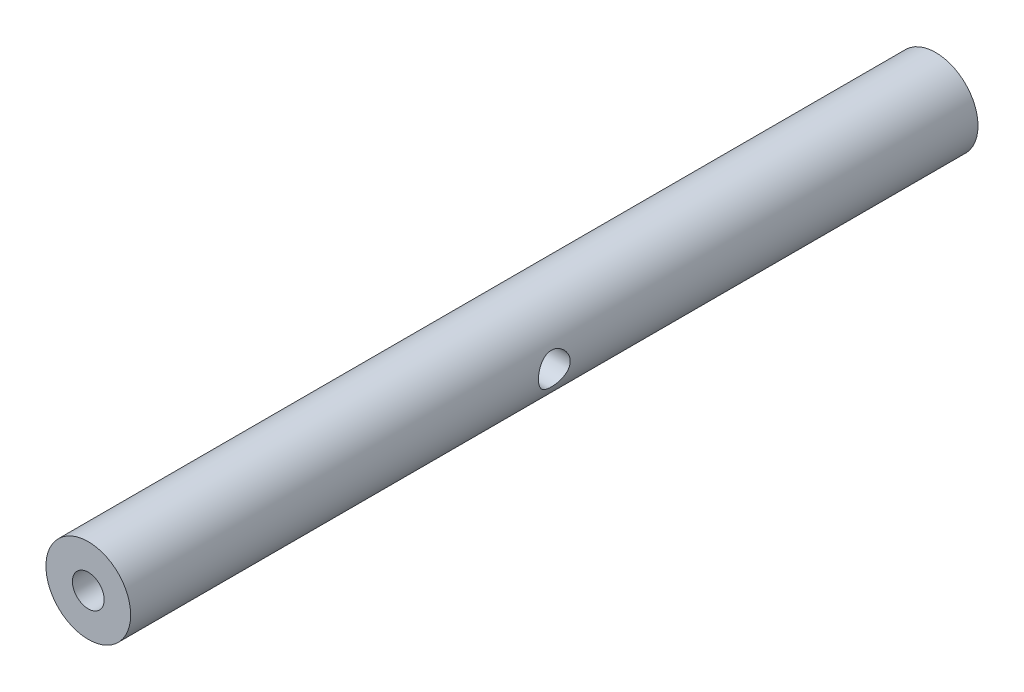
ISO-10303-21;
HEADER;
FILE_DESCRIPTION(('STEP AP214'),'2;1');
FILE_NAME('part.step','',(''),(''),'','','');
FILE_SCHEMA(('AUTOMOTIVE_DESIGN { 1 0 10303 214 1 1 1 1 }'));
ENDSEC;
DATA;
#1=APPLICATION_CONTEXT('core data for automotive mechanical design processes');
#2=APPLICATION_PROTOCOL_DEFINITION('international standard','automotive_design',2000,#1);
#3=PRODUCT_CONTEXT('',#1,'mechanical');
#4=PRODUCT('Part','Part','',(#3));
#5=PRODUCT_RELATED_PRODUCT_CATEGORY('part','',(#4));
#6=PRODUCT_DEFINITION_FORMATION('','',#4);
#7=PRODUCT_DEFINITION_CONTEXT('part definition',#1,'design');
#8=PRODUCT_DEFINITION('design','',#6,#7);
#9=PRODUCT_DEFINITION_SHAPE('','',#8);
#10=(LENGTH_UNIT() NAMED_UNIT(*) SI_UNIT(.MILLI.,.METRE.));
#11=(NAMED_UNIT(*) PLANE_ANGLE_UNIT() SI_UNIT($,.RADIAN.));
#12=(NAMED_UNIT(*) SI_UNIT($,.STERADIAN.) SOLID_ANGLE_UNIT());
#13=UNCERTAINTY_MEASURE_WITH_UNIT(LENGTH_MEASURE(1.E-05),#10,'distance_accuracy_value','');
#14=(GEOMETRIC_REPRESENTATION_CONTEXT(3) GLOBAL_UNCERTAINTY_ASSIGNED_CONTEXT((#13)) GLOBAL_UNIT_ASSIGNED_CONTEXT((#10,
#11,#12)) REPRESENTATION_CONTEXT('',''));
#15=CARTESIAN_POINT('',(0.,0.,0.));
#16=DIRECTION('',(0.,0.,1.));
#17=DIRECTION('',(1.,0.,0.));
#18=AXIS2_PLACEMENT_3D('',#15,#16,#17);
#19=CARTESIAN_POINT('',(0.,0.,80.));
#20=DIRECTION('',(0.,0.,-1.));
#21=DIRECTION('',(-1.,0.,0.));
#22=AXIS2_PLACEMENT_3D('',#19,#20,#21);
#23=CYLINDRICAL_SURFACE('',#22,1.5);
#24=CARTESIAN_POINT('',(0.,0.,40.));
#25=DIRECTION('',(0.707106781186547,0.,-0.707106781186547));
#26=DIRECTION('',(0.707106781186547,0.,0.707106781186547));
#27=AXIS2_PLACEMENT_3D('',#24,#25,#26);
#28=ELLIPSE('',#27,2.12132034355961,1.49999999999998);
#29=CARTESIAN_POINT('',(0.,1.5,40.));
#30=VERTEX_POINT('',#29);
#31=CARTESIAN_POINT('',(0.,-1.5,40.));
#32=VERTEX_POINT('',#31);
#33=EDGE_CURVE('E46',#30,#32,#28,.F.);
#34=ORIENTED_EDGE('',*,*,#33,.T.);
#35=CARTESIAN_POINT('',(0.,0.,40.));
#36=DIRECTION('',(-0.707106781186547,0.,-0.707106781186547));
#37=DIRECTION('',(-0.707106781186547,0.,0.707106781186547));
#38=AXIS2_PLACEMENT_3D('',#35,#36,#37);
#39=ELLIPSE('',#38,2.12132034355961,1.49999999999998);
#40=EDGE_CURVE('E59',#30,#32,#39,.T.);
#41=ORIENTED_EDGE('',*,*,#40,.F.);
#42=EDGE_LOOP('',(#34,#41));
#43=FACE_BOUND('',#42,.T.);
#44=CARTESIAN_POINT('',(0.,0.,0.));
#45=DIRECTION('',(0.,0.,1.));
#46=DIRECTION('',(1.,0.,0.));
#47=AXIS2_PLACEMENT_3D('',#44,#45,#46);
#48=CIRCLE('',#47,1.5);
#49=CARTESIAN_POINT('',(1.5,0.,0.));
#50=VERTEX_POINT('',#49);
#51=EDGE_CURVE('E86',#50,#50,#48,.T.);
#52=ORIENTED_EDGE('',*,*,#51,.F.);
#53=EDGE_LOOP('',(#52));
#54=FACE_BOUND('',#53,.T.);
#55=ADVANCED_FACE('F32',(#43,#54),#23,.F.);
#56=CARTESIAN_POINT('',(0.,0.,80.));
#57=DIRECTION('',(0.,0.,-1.));
#58=DIRECTION('',(-1.,0.,0.));
#59=AXIS2_PLACEMENT_3D('',#56,#57,#58);
#60=CYLINDRICAL_SURFACE('',#59,4.);
#61=CARTESIAN_POINT('',(-4.,0.,38.5));
#62=CARTESIAN_POINT('',(-4.00000217456151,-0.081235058937851,38.4999970976969));
#63=CARTESIAN_POINT('',(-3.99750379283184,-0.162450241781788,38.5066197602484));
#64=CARTESIAN_POINT('',(-3.98778696006927,-0.322453452352353,38.53282819527));
#65=CARTESIAN_POINT('',(-3.98056918893993,-0.401241827987605,38.5524121004706));
#66=CARTESIAN_POINT('',(-3.96218832391545,-0.554060784990863,38.6037530017718));
#67=CARTESIAN_POINT('',(-3.9510328434944,-0.62810022416226,38.6354865168218));
#68=CARTESIAN_POINT('',(-3.92588767765353,-0.769799310160232,38.7101064130159));
#69=CARTESIAN_POINT('',(-3.91189723227548,-0.837457239177856,38.7529957855442));
#70=CARTESIAN_POINT('',(-3.88186246971217,-0.967346417045797,38.850612531071));
#71=CARTESIAN_POINT('',(-3.86576002583566,-1.02927073015116,38.9057302622594));
#72=CARTESIAN_POINT('',(-3.83360220871327,-1.1432442147436,39.0254104346589));
#73=CARTESIAN_POINT('',(-3.81754685135033,-1.19529036359199,39.0899757560879));
#74=CARTESIAN_POINT('',(-3.78662470617732,-1.28998202215981,39.2297174675232));
#75=CARTESIAN_POINT('',(-3.77182648820819,-1.33219393195756,39.3052043665458));
#76=CARTESIAN_POINT('',(-3.74599860237434,-1.4031864633408,39.4628483541685));
#77=CARTESIAN_POINT('',(-3.73496742975882,-1.43197244961235,39.5450027631551));
#78=CARTESIAN_POINT('',(-3.71854412824137,-1.47408431017545,39.7101167402582));
#79=CARTESIAN_POINT('',(-3.71293924350839,-1.48799593218553,39.7929050384355));
#80=CARTESIAN_POINT('',(-3.70738061461216,-1.50179556531643,39.9598161579938));
#81=CARTESIAN_POINT('',(-3.70742453659306,-1.50168936802626,40.0439384138745));
#82=CARTESIAN_POINT('',(-3.71297511632056,-1.48790429610013,40.205769525213));
#83=CARTESIAN_POINT('',(-3.71815468871123,-1.47503808508999,40.2835609060442));
#84=CARTESIAN_POINT('',(-3.73284938059531,-1.43744167868325,40.4357871504053));
#85=CARTESIAN_POINT('',(-3.74236515298864,-1.41270969663254,40.5102215066139));
#86=CARTESIAN_POINT('',(-3.76485702190254,-1.35163748571899,40.6552770677282));
#87=CARTESIAN_POINT('',(-3.77789517988167,-1.31508648737096,40.7257994861213));
#88=CARTESIAN_POINT('',(-3.8059421013932,-1.23156073762694,40.8599457375909));
#89=CARTESIAN_POINT('',(-3.82095154457158,-1.18458238728893,40.9235671775197));
#90=CARTESIAN_POINT('',(-3.85248038859114,-1.07781780766545,41.0466036636508));
#91=CARTESIAN_POINT('',(-3.86903347455671,-1.01738298716952,41.1054486407481));
#92=CARTESIAN_POINT('',(-3.90091728164086,-0.88731259081899,41.2123379662058));
#93=CARTESIAN_POINT('',(-3.91624781465952,-0.817675603497334,41.2603806546056));
#94=CARTESIAN_POINT('',(-3.9442639480908,-0.669723436992392,41.3449303970625));
#95=CARTESIAN_POINT('',(-3.95690498259616,-0.591290713844694,41.381247581221));
#96=CARTESIAN_POINT('',(-3.97778718326962,-0.428836850524563,41.43998260427));
#97=CARTESIAN_POINT('',(-3.98603030341493,-0.344818210845749,41.4624066165611));
#98=CARTESIAN_POINT('',(-3.99684443228065,-0.178375243148652,41.4916227875419));
#99=CARTESIAN_POINT('',(-3.99969369025686,-0.0961036195621986,41.4991826063825));
#100=CARTESIAN_POINT('',(-4.00025893700125,0.06857247525503,41.5006910638999));
#101=CARTESIAN_POINT('',(-3.99797606386863,0.150976912983376,41.4946427203167));
#102=CARTESIAN_POINT('',(-3.98871709772643,0.310262048561857,41.4696899576913));
#103=CARTESIAN_POINT('',(-3.98192470962304,0.387233328007331,41.4512884562629));
#104=CARTESIAN_POINT('',(-3.96451477091717,0.536941754957212,41.4028139274526));
#105=CARTESIAN_POINT('',(-3.9538967228203,0.609678350347524,41.3727393820519));
#106=CARTESIAN_POINT('',(-3.92949624407681,0.75124776511014,41.3008135875605));
#107=CARTESIAN_POINT('',(-3.91563000209348,0.819903083557777,41.2586422707766));
#108=CARTESIAN_POINT('',(-3.88626671564664,0.949392711726602,41.1640818968284));
#109=CARTESIAN_POINT('',(-3.87076907009516,1.01022412027043,41.1116890674548));
#110=CARTESIAN_POINT('',(-3.8387332949099,1.12603079874451,40.9945958778757));
#111=CARTESIAN_POINT('',(-3.8221869650373,1.18046154123565,40.9293578172273));
#112=CARTESIAN_POINT('',(-3.79078815746854,1.277710500319,40.7903486152923));
#113=CARTESIAN_POINT('',(-3.775935831944,1.32052767414515,40.7165767086115));
#114=CARTESIAN_POINT('',(-3.74966829822464,1.39337773518994,40.5619840132277));
#115=CARTESIAN_POINT('',(-3.73826760328495,1.42335685446914,40.4811352540895));
#116=CARTESIAN_POINT('',(-3.72054032891006,1.46907883466885,40.3149902363122));
#117=CARTESIAN_POINT('',(-3.71421061057492,1.48483050305531,40.2296967638019));
#118=CARTESIAN_POINT('',(-3.70775894792575,1.50086347097834,40.0629838404589));
#119=CARTESIAN_POINT('',(-3.70726444523343,1.50207331495833,39.9816673682831));
#120=CARTESIAN_POINT('',(-3.71158412745294,1.49136715641588,39.8200546837238));
#121=CARTESIAN_POINT('',(-3.716397808989,1.47945239850119,39.7397583753284));
#122=CARTESIAN_POINT('',(-3.73048141585434,1.44355815630237,39.5849527732834));
#123=CARTESIAN_POINT('',(-3.73961085376664,1.41995798316519,39.5103416537547));
#124=CARTESIAN_POINT('',(-3.76121548297846,1.36169696779914,39.3660944915056));
#125=CARTESIAN_POINT('',(-3.77369151995216,1.32703332944939,39.2964597119299));
#126=CARTESIAN_POINT('',(-3.80139723903966,1.24552075938149,39.1601732103024));
#127=CARTESIAN_POINT('',(-3.81673698440965,1.19812832803005,39.0938692032001));
#128=CARTESIAN_POINT('',(-3.84806246757178,1.09334485729901,38.9698584390288));
#129=CARTESIAN_POINT('',(-3.86404840943146,1.03595064012804,38.9121544252133));
#130=CARTESIAN_POINT('',(-3.89590424609882,0.909080396784581,38.8037980441782));
#131=CARTESIAN_POINT('',(-3.91172104900645,0.839118644212953,38.7536962465654));
#132=CARTESIAN_POINT('',(-3.94054514457031,0.691213223200787,38.6659773447235));
#133=CARTESIAN_POINT('',(-3.95355221851559,0.61326893409059,38.6283612122637));
#134=CARTESIAN_POINT('',(-3.9757429260668,0.447999082002287,38.5656231709517));
#135=CARTESIAN_POINT('',(-3.98473657158356,0.360413422234188,38.5411129353981));
#136=CARTESIAN_POINT('',(-3.99686242179586,0.181875733606372,38.5083070400794));
#137=CARTESIAN_POINT('',(-3.99999756603967,0.0909254163648539,38.5000032485127));
#138=CARTESIAN_POINT('',(-4.,0.,38.5));
#139=B_SPLINE_CURVE_WITH_KNOTS('',3,(#61,#62,#63,#64,#65,#66,#67,#68,#69,#70,#71,#72,#73,#74,
#75,#76,#77,#78,#79,#80,#81,#82,#83,#84,#85,#86,#87,#88,#89,#90,#91,#92,#93,#94,#95,#96,#97,#98,
#99,#100,#101,#102,#103,#104,#105,#106,#107,#108,#109,#110,#111,#112,#113,#114,#115,#116,#117,
#118,#119,#120,#121,#122,#123,#124,#125,#126,#127,#128,#129,#130,#131,#132,#133,#134,#135,#136,
#137,#138),.UNSPECIFIED.,.T.,.F.,(4,2,2,2,2,2,2,2,2,2,2,2,2,2,2,2,2,2,2,2,2,2,2,2,2,2,2,2,2,2,2,
2,2,2,2,2,2,2,4),(0.,0.243369801560554,0.486704549530447,0.729571369213553,0.972503379609465,
1.22473618582712,1.47704604925617,1.73896674501654,2.00078269352128,2.25185874416895,
2.502831060797,2.73878345119963,2.9747713806058,3.21522408387008,3.45575990744248,
3.71246153335801,3.96920257905054,4.22991375286062,4.49050899698832,4.73725019635911,
4.98393668390505,5.22114437923824,5.45838293254437,5.70259221859582,5.94689180019849,
6.20536519455639,6.46386178920121,6.72343066727183,6.98283874956486,7.2255876348023,
7.46831350211236,7.70363142426512,7.93900886656483,8.18672471884247,8.43451941997036,
8.69572329654012,8.95694749805075,9.22948515032013,9.50188601796097),.UNSPECIFIED.);
#140=CARTESIAN_POINT('',(-4.,0.,38.5));
#141=VERTEX_POINT('',#140);
#142=EDGE_CURVE('E60',#141,#141,#139,.T.);
#143=ORIENTED_EDGE('',*,*,#142,.F.);
#144=EDGE_LOOP('',(#143));
#145=FACE_BOUND('',#144,.T.);
#146=CARTESIAN_POINT('',(0.,0.,80.));
#147=DIRECTION('',(0.,0.,1.));
#148=DIRECTION('',(1.,0.,0.));
#149=AXIS2_PLACEMENT_3D('',#146,#147,#148);
#150=CIRCLE('',#149,4.);
#151=CARTESIAN_POINT('',(4.,0.,80.));
#152=VERTEX_POINT('',#151);
#153=EDGE_CURVE('E11',#152,#152,#150,.T.);
#154=ORIENTED_EDGE('',*,*,#153,.F.);
#155=EDGE_LOOP('',(#154));
#156=FACE_BOUND('',#155,.T.);
#157=CARTESIAN_POINT('',(0.,0.,0.));
#158=DIRECTION('',(0.,0.,1.));
#159=DIRECTION('',(1.,0.,0.));
#160=AXIS2_PLACEMENT_3D('',#157,#158,#159);
#161=CIRCLE('',#160,4.);
#162=CARTESIAN_POINT('',(4.,0.,0.));
#163=VERTEX_POINT('',#162);
#164=EDGE_CURVE('E36',#163,#163,#161,.T.);
#165=ORIENTED_EDGE('',*,*,#164,.T.);
#166=EDGE_LOOP('',(#165));
#167=FACE_BOUND('',#166,.T.);
#168=CARTESIAN_POINT('',(4.,0.,41.5));
#169=CARTESIAN_POINT('',(4.00000217456151,0.0812350589378506,41.5000029023031));
#170=CARTESIAN_POINT('',(3.99750379283184,0.162450241781788,41.4933802397516));
#171=CARTESIAN_POINT('',(3.98778696006927,0.322453452352352,41.46717180473));
#172=CARTESIAN_POINT('',(3.98056918893993,0.401241827987604,41.4475878995294));
#173=CARTESIAN_POINT('',(3.96218832391545,0.554060784990863,41.3962469982282));
#174=CARTESIAN_POINT('',(3.9510328434944,0.62810022416226,41.3645134831782));
#175=CARTESIAN_POINT('',(3.92588767765353,0.769799310160232,41.2898935869841));
#176=CARTESIAN_POINT('',(3.91189723227548,0.837457239177856,41.2470042144558));
#177=CARTESIAN_POINT('',(3.88186246971217,0.967346417045797,41.149387468929));
#178=CARTESIAN_POINT('',(3.86576002583566,1.02927073015116,41.0942697377406));
#179=CARTESIAN_POINT('',(3.83360220871327,1.1432442147436,40.9745895653411));
#180=CARTESIAN_POINT('',(3.81754685135033,1.19529036359199,40.9100242439121));
#181=CARTESIAN_POINT('',(3.78662470617732,1.28998202215981,40.7702825324768));
#182=CARTESIAN_POINT('',(3.77182648820819,1.33219393195756,40.6947956334542));
#183=CARTESIAN_POINT('',(3.74599860237434,1.4031864633408,40.5371516458315));
#184=CARTESIAN_POINT('',(3.73496742975882,1.43197244961235,40.4549972368449));
#185=CARTESIAN_POINT('',(3.71854412824137,1.47408431017545,40.2898832597418));
#186=CARTESIAN_POINT('',(3.71293924350839,1.48799593218553,40.2070949615645));
#187=CARTESIAN_POINT('',(3.70738061461216,1.50179556531643,40.0401838420062));
#188=CARTESIAN_POINT('',(3.70742453659306,1.50168936802626,39.9560615861255));
#189=CARTESIAN_POINT('',(3.71297511632056,1.48790429610013,39.794230474787));
#190=CARTESIAN_POINT('',(3.71815468871123,1.47503808508999,39.7164390939558));
#191=CARTESIAN_POINT('',(3.73284938059531,1.43744167868325,39.5642128495947));
#192=CARTESIAN_POINT('',(3.74236515298864,1.41270969663254,39.4897784933861));
#193=CARTESIAN_POINT('',(3.76485702190254,1.351637485719,39.3447229322718));
#194=CARTESIAN_POINT('',(3.77789517988167,1.31508648737097,39.2742005138787));
#195=CARTESIAN_POINT('',(3.8059421013932,1.23156073762694,39.1400542624091));
#196=CARTESIAN_POINT('',(3.82095154457158,1.18458238728893,39.0764328224803));
#197=CARTESIAN_POINT('',(3.85248038859114,1.07781780766545,38.9533963363492));
#198=CARTESIAN_POINT('',(3.86903347455671,1.01738298716952,38.8945513592519));
#199=CARTESIAN_POINT('',(3.90091728164086,0.88731259081899,38.7876620337942));
#200=CARTESIAN_POINT('',(3.91624781465952,0.817675603497334,38.7396193453944));
#201=CARTESIAN_POINT('',(3.9442639480908,0.669723436992392,38.6550696029375));
#202=CARTESIAN_POINT('',(3.95690498259616,0.591290713844694,38.618752418779));
#203=CARTESIAN_POINT('',(3.97778718326962,0.428836850524563,38.56001739573));
#204=CARTESIAN_POINT('',(3.98603030341493,0.344818210845749,38.5375933834389));
#205=CARTESIAN_POINT('',(3.99684443228065,0.178375243148652,38.5083772124581));
#206=CARTESIAN_POINT('',(3.99969369025686,0.0961036195621986,38.5008173936175));
#207=CARTESIAN_POINT('',(4.00025893700125,-0.06857247525503,38.4993089361001));
#208=CARTESIAN_POINT('',(3.99797606386863,-0.150976912983376,38.5053572796833));
#209=CARTESIAN_POINT('',(3.98871709772643,-0.310262048561858,38.5303100423087));
#210=CARTESIAN_POINT('',(3.98192470962304,-0.387233328007333,38.5487115437371));
#211=CARTESIAN_POINT('',(3.96451477091717,-0.536941754957213,38.5971860725474));
#212=CARTESIAN_POINT('',(3.9538967228203,-0.609678350347524,38.6272606179481));
#213=CARTESIAN_POINT('',(3.92949624407681,-0.75124776511014,38.6991864124395));
#214=CARTESIAN_POINT('',(3.91563000209348,-0.819903083557777,38.7413577292234));
#215=CARTESIAN_POINT('',(3.88626671564664,-0.949392711726602,38.8359181031716));
#216=CARTESIAN_POINT('',(3.87076907009516,-1.01022412027043,38.8883109325452));
#217=CARTESIAN_POINT('',(3.8387332949099,-1.12603079874451,39.0054041221243));
#218=CARTESIAN_POINT('',(3.8221869650373,-1.18046154123565,39.0706421827727));
#219=CARTESIAN_POINT('',(3.79078815746854,-1.277710500319,39.2096513847077));
#220=CARTESIAN_POINT('',(3.775935831944,-1.32052767414515,39.2834232913885));
#221=CARTESIAN_POINT('',(3.74966829822464,-1.39337773518994,39.4380159867723));
#222=CARTESIAN_POINT('',(3.73826760328495,-1.42335685446914,39.5188647459105));
#223=CARTESIAN_POINT('',(3.72054032891006,-1.46907883466885,39.6850097636878));
#224=CARTESIAN_POINT('',(3.71421061057492,-1.48483050305531,39.7703032361981));
#225=CARTESIAN_POINT('',(3.70775894792575,-1.50086347097834,39.9370161595411));
#226=CARTESIAN_POINT('',(3.70726444523343,-1.50207331495833,40.0183326317169));
#227=CARTESIAN_POINT('',(3.71158412745294,-1.49136715641588,40.1799453162762));
#228=CARTESIAN_POINT('',(3.716397808989,-1.47945239850119,40.2602416246716));
#229=CARTESIAN_POINT('',(3.73048141585434,-1.44355815630237,40.4150472267166));
#230=CARTESIAN_POINT('',(3.73961085376664,-1.41995798316519,40.4896583462453));
#231=CARTESIAN_POINT('',(3.76121548297846,-1.36169696779915,40.6339055084944));
#232=CARTESIAN_POINT('',(3.77369151995216,-1.3270333294494,40.7035402880701));
#233=CARTESIAN_POINT('',(3.80139723903966,-1.24552075938149,40.8398267896976));
#234=CARTESIAN_POINT('',(3.81673698440965,-1.19812832803005,40.9061307967999));
#235=CARTESIAN_POINT('',(3.84806246757178,-1.09334485729901,41.0301415609712));
#236=CARTESIAN_POINT('',(3.86404840943146,-1.03595064012804,41.0878455747867));
#237=CARTESIAN_POINT('',(3.89590424609882,-0.90908039678458,41.1962019558218));
#238=CARTESIAN_POINT('',(3.91172104900645,-0.839118644212952,41.2463037534346));
#239=CARTESIAN_POINT('',(3.94054514457031,-0.691213223200785,41.3340226552765));
#240=CARTESIAN_POINT('',(3.95355221851559,-0.613268934090588,41.3716387877363));
#241=CARTESIAN_POINT('',(3.9757429260668,-0.447999082002286,41.4343768290483));
#242=CARTESIAN_POINT('',(3.98473657158356,-0.360413422234188,41.4588870646019));
#243=CARTESIAN_POINT('',(3.99686242179586,-0.181875733606372,41.4916929599206));
#244=CARTESIAN_POINT('',(3.99999756603967,-0.0909254163648539,41.4999967514873));
#245=CARTESIAN_POINT('',(4.,0.,41.5));
#246=B_SPLINE_CURVE_WITH_KNOTS('',3,(#168,#169,#170,#171,#172,#173,#174,#175,#176,#177,#178,
#179,#180,#181,#182,#183,#184,#185,#186,#187,#188,#189,#190,#191,#192,#193,#194,#195,#196,#197,
#198,#199,#200,#201,#202,#203,#204,#205,#206,#207,#208,#209,#210,#211,#212,#213,#214,#215,#216,
#217,#218,#219,#220,#221,#222,#223,#224,#225,#226,#227,#228,#229,#230,#231,#232,#233,#234,#235,
#236,#237,#238,#239,#240,#241,#242,#243,#244,#245),.UNSPECIFIED.,.T.,.F.,(4,2,2,2,2,2,2,2,2,2,2,
2,2,2,2,2,2,2,2,2,2,2,2,2,2,2,2,2,2,2,2,2,2,2,2,2,2,2,4),(0.,0.243369801560553,
0.486704549530447,0.729571369213553,0.972503379609465,1.22473618582712,1.47704604925617,
1.73896674501654,2.00078269352128,2.25185874416895,2.502831060797,2.73878345119963,
2.9747713806058,3.21522408387008,3.45575990744248,3.71246153335801,3.96920257905054,
4.22991375286062,4.49050899698832,4.73725019635911,4.98393668390505,5.22114437923824,
5.45838293254437,5.70259221859582,5.94689180019849,6.20536519455639,6.46386178920121,
6.72343066727183,6.98283874956486,7.2255876348023,7.46831350211236,7.70363142426509,
7.93900886656483,8.18672471884247,8.43451941997036,8.69572329654013,8.95694749805075,
9.22948515032013,9.50188601796097),.UNSPECIFIED.);
#247=CARTESIAN_POINT('',(4.,0.,41.5));
#248=VERTEX_POINT('',#247);
#249=EDGE_CURVE('E66',#248,#248,#246,.T.);
#250=ORIENTED_EDGE('',*,*,#249,.T.);
#251=EDGE_LOOP('',(#250));
#252=FACE_BOUND('',#251,.T.);
#253=ADVANCED_FACE('F34',(#145,#156,#167,#252),#60,.T.);
#254=CARTESIAN_POINT('',(0.,0.,40.));
#255=DIRECTION('',(0.707106781186547,0.,0.707106781186547));
#256=DIRECTION('',(0.707106781186547,0.,-0.707106781186547));
#257=AXIS2_PLACEMENT_3D('',#254,#255,#256);
#258=ELLIPSE('',#257,2.12132034355961,1.49999999999998);
#259=EDGE_CURVE('E48',#32,#30,#258,.F.);
#260=ORIENTED_EDGE('',*,*,#259,.T.);
#261=CARTESIAN_POINT('',(0.,0.,40.));
#262=DIRECTION('',(-0.707106781186547,0.,0.707106781186547));
#263=DIRECTION('',(-0.707106781186547,0.,-0.707106781186547));
#264=AXIS2_PLACEMENT_3D('',#261,#262,#263);
#265=ELLIPSE('',#264,2.12132034355961,1.49999999999998);
#266=EDGE_CURVE('E65',#32,#30,#265,.T.);
#267=ORIENTED_EDGE('',*,*,#266,.F.);
#268=EDGE_LOOP('',(#260,#267));
#269=FACE_BOUND('',#268,.T.);
#270=CARTESIAN_POINT('',(0.,0.,80.));
#271=DIRECTION('',(0.,0.,1.));
#272=DIRECTION('',(1.,0.,0.));
#273=AXIS2_PLACEMENT_3D('',#270,#271,#272);
#274=CIRCLE('',#273,1.5);
#275=CARTESIAN_POINT('',(1.5,0.,80.));
#276=VERTEX_POINT('',#275);
#277=EDGE_CURVE('E87',#276,#276,#274,.T.);
#278=ORIENTED_EDGE('',*,*,#277,.T.);
#279=EDGE_LOOP('',(#278));
#280=FACE_BOUND('',#279,.T.);
#281=ADVANCED_FACE('F68',(#269,#280),#23,.F.);
#282=CARTESIAN_POINT('',(0.,0.,80.));
#283=DIRECTION('',(0.,0.,1.));
#284=DIRECTION('',(1.,0.,0.));
#285=AXIS2_PLACEMENT_3D('',#282,#283,#284);
#286=PLANE('',#285);
#287=ORIENTED_EDGE('',*,*,#153,.T.);
#288=EDGE_LOOP('',(#287));
#289=FACE_BOUND('',#288,.T.);
#290=ORIENTED_EDGE('',*,*,#277,.F.);
#291=EDGE_LOOP('',(#290));
#292=FACE_BOUND('',#291,.T.);
#293=ADVANCED_FACE('F106',(#289,#292),#286,.T.);
#294=CARTESIAN_POINT('',(0.,0.,0.));
#295=DIRECTION('',(0.,0.,1.));
#296=DIRECTION('',(1.,0.,0.));
#297=AXIS2_PLACEMENT_3D('',#294,#295,#296);
#298=PLANE('',#297);
#299=ORIENTED_EDGE('',*,*,#164,.F.);
#300=EDGE_LOOP('',(#299));
#301=FACE_BOUND('',#300,.T.);
#302=ORIENTED_EDGE('',*,*,#51,.T.);
#303=EDGE_LOOP('',(#302));
#304=FACE_BOUND('',#303,.T.);
#305=ADVANCED_FACE('F98',(#301,#304),#298,.F.);
#306=CARTESIAN_POINT('',(4.001,0.,40.));
#307=DIRECTION('',(-1.,0.,0.));
#308=DIRECTION('',(0.,0.,1.));
#309=AXIS2_PLACEMENT_3D('',#306,#307,#308);
#310=CYLINDRICAL_SURFACE('',#309,1.49999999999995);
#311=ORIENTED_EDGE('',*,*,#40,.T.);
#312=ORIENTED_EDGE('',*,*,#266,.T.);
#313=EDGE_LOOP('',(#311,#312));
#314=FACE_BOUND('',#313,.T.);
#315=ORIENTED_EDGE('',*,*,#249,.F.);
#316=EDGE_LOOP('',(#315));
#317=FACE_BOUND('',#316,.T.);
#318=ADVANCED_FACE('F63',(#314,#317),#310,.F.);
#319=CARTESIAN_POINT('',(-4.001,0.,40.));
#320=DIRECTION('',(1.,0.,0.));
#321=DIRECTION('',(0.,0.,-1.));
#322=AXIS2_PLACEMENT_3D('',#319,#320,#321);
#323=CYLINDRICAL_SURFACE('',#322,1.49999999999995);
#324=ORIENTED_EDGE('',*,*,#259,.F.);
#325=ORIENTED_EDGE('',*,*,#33,.F.);
#326=EDGE_LOOP('',(#324,#325));
#327=FACE_BOUND('',#326,.T.);
#328=ORIENTED_EDGE('',*,*,#142,.T.);
#329=EDGE_LOOP('',(#328));
#330=FACE_BOUND('',#329,.T.);
#331=ADVANCED_FACE('F49',(#327,#330),#323,.F.);
#332=CLOSED_SHELL('',(#55,#253,#281,#293,#305,#318,#331));
#333=MANIFOLD_SOLID_BREP('B2',#332);
#334=ADVANCED_BREP_SHAPE_REPRESENTATION('',(#18,#333),#14);
#335=SHAPE_DEFINITION_REPRESENTATION(#9,#334);
ENDSEC;
END-ISO-10303-21;
